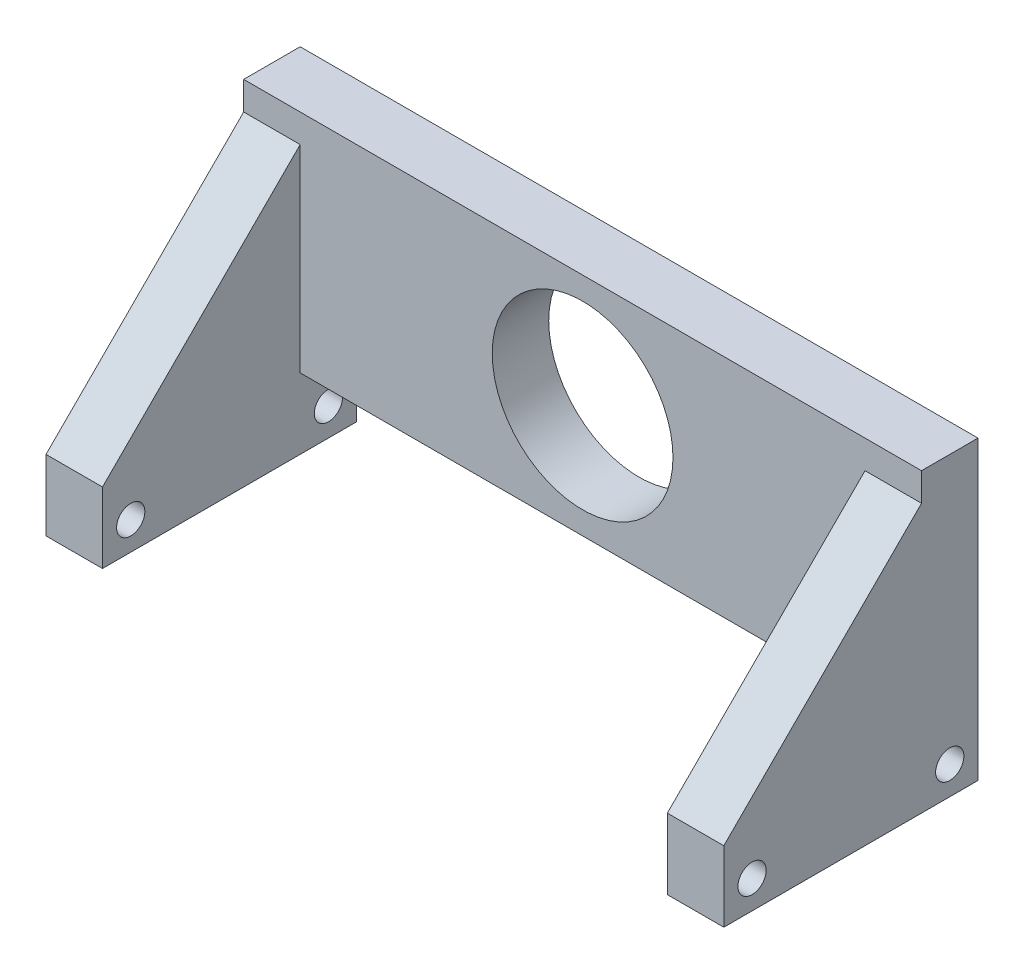
ISO-10303-21;
HEADER;
FILE_DESCRIPTION(('STEP AP214'),'2;1');
FILE_NAME('part.step','',(''),(''),'','','');
FILE_SCHEMA(('AUTOMOTIVE_DESIGN { 1 0 10303 214 1 1 1 1 }'));
ENDSEC;
DATA;
#1=APPLICATION_CONTEXT('core data for automotive mechanical design processes');
#2=APPLICATION_PROTOCOL_DEFINITION('international standard','automotive_design',2000,#1);
#3=PRODUCT_CONTEXT('',#1,'mechanical');
#4=PRODUCT('Part','Part','',(#3));
#5=PRODUCT_RELATED_PRODUCT_CATEGORY('part','',(#4));
#6=PRODUCT_DEFINITION_FORMATION('','',#4);
#7=PRODUCT_DEFINITION_CONTEXT('part definition',#1,'design');
#8=PRODUCT_DEFINITION('design','',#6,#7);
#9=PRODUCT_DEFINITION_SHAPE('','',#8);
#10=(LENGTH_UNIT() NAMED_UNIT(*) SI_UNIT(.MILLI.,.METRE.));
#11=(NAMED_UNIT(*) PLANE_ANGLE_UNIT() SI_UNIT($,.RADIAN.));
#12=(NAMED_UNIT(*) SI_UNIT($,.STERADIAN.) SOLID_ANGLE_UNIT());
#13=UNCERTAINTY_MEASURE_WITH_UNIT(LENGTH_MEASURE(1.E-05),#10,'distance_accuracy_value','');
#14=(GEOMETRIC_REPRESENTATION_CONTEXT(3) GLOBAL_UNCERTAINTY_ASSIGNED_CONTEXT((#13)) GLOBAL_UNIT_ASSIGNED_CONTEXT((#10,
#11,#12)) REPRESENTATION_CONTEXT('',''));
#15=CARTESIAN_POINT('',(0.,0.,0.));
#16=DIRECTION('',(0.,0.,1.));
#17=DIRECTION('',(1.,0.,0.));
#18=AXIS2_PLACEMENT_3D('',#15,#16,#17);
#19=CARTESIAN_POINT('',(-50.,20.,10.));
#20=DIRECTION('',(0.,-1.,0.));
#21=DIRECTION('',(0.,0.,-1.));
#22=AXIS2_PLACEMENT_3D('',#19,#20,#21);
#23=PLANE('',#22);
#24=DIRECTION('',(-1.,0.,0.));
#25=VECTOR('',#24,1.);
#26=CARTESIAN_POINT('',(-50.,20.,0.));
#27=LINE('',#26,#25);
#28=CARTESIAN_POINT('',(60.,20.,0.));
#29=VERTEX_POINT('',#28);
#30=CARTESIAN_POINT('',(-60.,20.,0.));
#31=VERTEX_POINT('',#30);
#32=EDGE_CURVE('E125',#29,#31,#27,.T.);
#33=ORIENTED_EDGE('',*,*,#32,.T.);
#34=DIRECTION('',(0.,0.,-1.));
#35=VECTOR('',#34,1.);
#36=CARTESIAN_POINT('',(-60.,20.,0.));
#37=LINE('',#36,#35);
#38=CARTESIAN_POINT('',(-60.,20.,10.));
#39=VERTEX_POINT('',#38);
#40=EDGE_CURVE('E208',#39,#31,#37,.T.);
#41=ORIENTED_EDGE('',*,*,#40,.F.);
#42=DIRECTION('',(-1.,0.,0.));
#43=VECTOR('',#42,1.);
#44=CARTESIAN_POINT('',(-50.,20.,10.));
#45=LINE('',#44,#43);
#46=CARTESIAN_POINT('',(60.,20.,10.));
#47=VERTEX_POINT('',#46);
#48=EDGE_CURVE('E152',#47,#39,#45,.T.);
#49=ORIENTED_EDGE('',*,*,#48,.F.);
#50=DIRECTION('',(0.,0.,-1.));
#51=VECTOR('',#50,1.);
#52=CARTESIAN_POINT('',(60.,20.,0.));
#53=LINE('',#52,#51);
#54=EDGE_CURVE('E144',#47,#29,#53,.T.);
#55=ORIENTED_EDGE('',*,*,#54,.T.);
#56=EDGE_LOOP('',(#33,#41,#49,#55));
#57=FACE_BOUND('',#56,.T.);
#58=ADVANCED_FACE('F37',(#57),#23,.F.);
#59=CARTESIAN_POINT('',(-50.,-20.,10.));
#60=DIRECTION('',(0.,1.,0.));
#61=DIRECTION('',(0.,0.,1.));
#62=AXIS2_PLACEMENT_3D('',#59,#60,#61);
#63=PLANE('',#62);
#64=DIRECTION('',(1.,0.,0.));
#65=VECTOR('',#64,1.);
#66=CARTESIAN_POINT('',(-50.,-20.,0.));
#67=LINE('',#66,#65);
#68=CARTESIAN_POINT('',(-50.,-20.,0.));
#69=VERTEX_POINT('',#68);
#70=CARTESIAN_POINT('',(50.,-20.,0.));
#71=VERTEX_POINT('',#70);
#72=EDGE_CURVE('E137',#69,#71,#67,.T.);
#73=ORIENTED_EDGE('',*,*,#72,.T.);
#74=DIRECTION('',(0.,0.,-1.));
#75=VECTOR('',#74,1.);
#76=CARTESIAN_POINT('',(50.,-20.,10.));
#77=LINE('',#76,#75);
#78=CARTESIAN_POINT('',(50.,-20.,10.));
#79=VERTEX_POINT('',#78);
#80=EDGE_CURVE('E44',#79,#71,#77,.T.);
#81=ORIENTED_EDGE('',*,*,#80,.F.);
#82=DIRECTION('',(1.,0.,0.));
#83=VECTOR('',#82,1.);
#84=CARTESIAN_POINT('',(-50.,-20.,10.));
#85=LINE('',#84,#83);
#86=CARTESIAN_POINT('',(-50.,-20.,10.));
#87=VERTEX_POINT('',#86);
#88=EDGE_CURVE('E56',#87,#79,#85,.T.);
#89=ORIENTED_EDGE('',*,*,#88,.F.);
#90=DIRECTION('',(0.,0.,-1.));
#91=VECTOR('',#90,1.);
#92=CARTESIAN_POINT('',(-50.,-20.,10.));
#93=LINE('',#92,#91);
#94=EDGE_CURVE('E11',#87,#69,#93,.T.);
#95=ORIENTED_EDGE('',*,*,#94,.T.);
#96=EDGE_LOOP('',(#73,#81,#89,#95));
#97=FACE_BOUND('',#96,.T.);
#98=ADVANCED_FACE('F269',(#97),#63,.F.);
#99=CARTESIAN_POINT('',(0.,0.,10.));
#100=DIRECTION('',(0.,0.,1.));
#101=DIRECTION('',(1.,0.,0.));
#102=AXIS2_PLACEMENT_3D('',#99,#100,#101);
#103=PLANE('',#102);
#104=CARTESIAN_POINT('',(0.,0.,10.));
#105=DIRECTION('',(0.,0.,1.));
#106=DIRECTION('',(1.,0.,0.));
#107=AXIS2_PLACEMENT_3D('',#104,#105,#106);
#108=CIRCLE('',#107,16.);
#109=CARTESIAN_POINT('',(16.,0.,10.));
#110=VERTEX_POINT('',#109);
#111=EDGE_CURVE('E229',#110,#110,#108,.T.);
#112=ORIENTED_EDGE('',*,*,#111,.F.);
#113=EDGE_LOOP('',(#112));
#114=FACE_BOUND('',#113,.T.);
#115=DIRECTION('',(0.,1.,0.));
#116=VECTOR('',#115,1.);
#117=CARTESIAN_POINT('',(50.,20.,10.));
#118=LINE('',#117,#116);
#119=CARTESIAN_POINT('',(50.,14.9999999999999,10.));
#120=VERTEX_POINT('',#119);
#121=EDGE_CURVE('E51',#79,#120,#118,.T.);
#122=ORIENTED_EDGE('',*,*,#121,.T.);
#123=DIRECTION('',(-1.,0.,0.));
#124=VECTOR('',#123,1.);
#125=CARTESIAN_POINT('',(60.,14.9999999999999,10.));
#126=LINE('',#125,#124);
#127=CARTESIAN_POINT('',(60.,14.9999999999999,10.));
#128=VERTEX_POINT('',#127);
#129=EDGE_CURVE('E182',#128,#120,#126,.T.);
#130=ORIENTED_EDGE('',*,*,#129,.F.);
#131=DIRECTION('',(0.,1.,0.));
#132=VECTOR('',#131,1.);
#133=CARTESIAN_POINT('',(60.,20.,10.));
#134=LINE('',#133,#132);
#135=EDGE_CURVE('E153',#128,#47,#134,.T.);
#136=ORIENTED_EDGE('',*,*,#135,.T.);
#137=ORIENTED_EDGE('',*,*,#48,.T.);
#138=DIRECTION('',(0.,1.,0.));
#139=VECTOR('',#138,1.);
#140=CARTESIAN_POINT('',(-60.,20.,10.));
#141=LINE('',#140,#139);
#142=CARTESIAN_POINT('',(-60.,14.9999999999999,10.));
#143=VERTEX_POINT('',#142);
#144=EDGE_CURVE('E205',#143,#39,#141,.T.);
#145=ORIENTED_EDGE('',*,*,#144,.F.);
#146=DIRECTION('',(1.,0.,0.));
#147=VECTOR('',#146,1.);
#148=CARTESIAN_POINT('',(-60.,14.9999999999999,10.));
#149=LINE('',#148,#147);
#150=CARTESIAN_POINT('',(-50.,14.9999999999999,10.));
#151=VERTEX_POINT('',#150);
#152=EDGE_CURVE('E210',#143,#151,#149,.T.);
#153=ORIENTED_EDGE('',*,*,#152,.T.);
#154=DIRECTION('',(0.,-1.,0.));
#155=VECTOR('',#154,1.);
#156=CARTESIAN_POINT('',(-50.,20.,10.));
#157=LINE('',#156,#155);
#158=EDGE_CURVE('E236',#151,#87,#157,.T.);
#159=ORIENTED_EDGE('',*,*,#158,.T.);
#160=ORIENTED_EDGE('',*,*,#88,.T.);
#161=EDGE_LOOP('',(#122,#130,#136,#137,#145,#153,#159,#160));
#162=FACE_BOUND('',#161,.T.);
#163=ADVANCED_FACE('F256',(#114,#162),#103,.T.);
#164=CARTESIAN_POINT('',(0.,0.,0.));
#165=DIRECTION('',(0.,0.,1.));
#166=DIRECTION('',(1.,0.,0.));
#167=AXIS2_PLACEMENT_3D('',#164,#165,#166);
#168=PLANE('',#167);
#169=CARTESIAN_POINT('',(0.,0.,0.));
#170=DIRECTION('',(0.,0.,1.));
#171=DIRECTION('',(1.,0.,0.));
#172=AXIS2_PLACEMENT_3D('',#169,#170,#171);
#173=CIRCLE('',#172,16.);
#174=CARTESIAN_POINT('',(16.,0.,0.));
#175=VERTEX_POINT('',#174);
#176=EDGE_CURVE('E138',#175,#175,#173,.T.);
#177=ORIENTED_EDGE('',*,*,#176,.T.);
#178=EDGE_LOOP('',(#177));
#179=FACE_BOUND('',#178,.T.);
#180=ORIENTED_EDGE('',*,*,#32,.F.);
#181=DIRECTION('',(0.,-1.,0.));
#182=VECTOR('',#181,1.);
#183=CARTESIAN_POINT('',(60.,20.,0.));
#184=LINE('',#183,#182);
#185=CARTESIAN_POINT('',(60.,-32.5,0.));
#186=VERTEX_POINT('',#185);
#187=EDGE_CURVE('E129',#29,#186,#184,.T.);
#188=ORIENTED_EDGE('',*,*,#187,.T.);
#189=DIRECTION('',(-1.,0.,0.));
#190=VECTOR('',#189,1.);
#191=CARTESIAN_POINT('',(60.,-32.5,0.));
#192=LINE('',#191,#190);
#193=CARTESIAN_POINT('',(50.,-32.5,0.));
#194=VERTEX_POINT('',#193);
#195=EDGE_CURVE('E165',#186,#194,#192,.T.);
#196=ORIENTED_EDGE('',*,*,#195,.T.);
#197=DIRECTION('',(0.,-1.,0.));
#198=VECTOR('',#197,1.);
#199=CARTESIAN_POINT('',(50.,20.,0.));
#200=LINE('',#199,#198);
#201=EDGE_CURVE('E166',#71,#194,#200,.T.);
#202=ORIENTED_EDGE('',*,*,#201,.F.);
#203=ORIENTED_EDGE('',*,*,#72,.F.);
#204=DIRECTION('',(0.,-1.,0.));
#205=VECTOR('',#204,1.);
#206=CARTESIAN_POINT('',(-50.,20.,0.));
#207=LINE('',#206,#205);
#208=CARTESIAN_POINT('',(-50.,-32.5,0.));
#209=VERTEX_POINT('',#208);
#210=EDGE_CURVE('E194',#69,#209,#207,.T.);
#211=ORIENTED_EDGE('',*,*,#210,.T.);
#212=DIRECTION('',(1.,0.,0.));
#213=VECTOR('',#212,1.);
#214=CARTESIAN_POINT('',(-60.,-32.5,0.));
#215=LINE('',#214,#213);
#216=CARTESIAN_POINT('',(-60.,-32.5,0.));
#217=VERTEX_POINT('',#216);
#218=EDGE_CURVE('E226',#217,#209,#215,.T.);
#219=ORIENTED_EDGE('',*,*,#218,.F.);
#220=DIRECTION('',(0.,-1.,0.));
#221=VECTOR('',#220,1.);
#222=CARTESIAN_POINT('',(-60.,20.,0.));
#223=LINE('',#222,#221);
#224=EDGE_CURVE('E132',#31,#217,#223,.T.);
#225=ORIENTED_EDGE('',*,*,#224,.F.);
#226=EDGE_LOOP('',(#180,#188,#196,#202,#203,#211,#219,#225));
#227=FACE_BOUND('',#226,.T.);
#228=ADVANCED_FACE('F127',(#179,#227),#168,.F.);
#229=CARTESIAN_POINT('',(0.,0.,0.));
#230=DIRECTION('',(0.,0.,1.));
#231=DIRECTION('',(1.,0.,0.));
#232=AXIS2_PLACEMENT_3D('',#229,#230,#231);
#233=CYLINDRICAL_SURFACE('',#232,16.);
#234=ORIENTED_EDGE('',*,*,#176,.F.);
#235=EDGE_LOOP('',(#234));
#236=FACE_BOUND('',#235,.T.);
#237=ORIENTED_EDGE('',*,*,#111,.T.);
#238=EDGE_LOOP('',(#237));
#239=FACE_BOUND('',#238,.T.);
#240=ADVANCED_FACE('F299',(#236,#239),#233,.F.);
#241=CARTESIAN_POINT('',(-60.,0.,0.));
#242=DIRECTION('',(-1.,0.,0.));
#243=DIRECTION('',(0.,0.,1.));
#244=AXIS2_PLACEMENT_3D('',#241,#242,#243);
#245=PLANE('',#244);
#246=CARTESIAN_POINT('',(-60.,-27.5,5.));
#247=DIRECTION('',(-1.,0.,0.));
#248=DIRECTION('',(0.,0.,1.));
#249=AXIS2_PLACEMENT_3D('',#246,#247,#248);
#250=CIRCLE('',#249,2.5);
#251=CARTESIAN_POINT('',(-60.,-27.5,7.5));
#252=VERTEX_POINT('',#251);
#253=EDGE_CURVE('E191',#252,#252,#250,.T.);
#254=ORIENTED_EDGE('',*,*,#253,.F.);
#255=EDGE_LOOP('',(#254));
#256=FACE_BOUND('',#255,.T.);
#257=ORIENTED_EDGE('',*,*,#224,.T.);
#258=DIRECTION('',(0.,0.,1.));
#259=VECTOR('',#258,1.);
#260=CARTESIAN_POINT('',(-60.,-32.5,0.));
#261=LINE('',#260,#259);
#262=CARTESIAN_POINT('',(-60.,-32.5,45.));
#263=VERTEX_POINT('',#262);
#264=EDGE_CURVE('E198',#217,#263,#261,.T.);
#265=ORIENTED_EDGE('',*,*,#264,.T.);
#266=DIRECTION('',(0.,1.,0.));
#267=VECTOR('',#266,1.);
#268=CARTESIAN_POINT('',(-60.,-32.5,45.));
#269=LINE('',#268,#267);
#270=CARTESIAN_POINT('',(-60.,-20.,45.));
#271=VERTEX_POINT('',#270);
#272=EDGE_CURVE('E201',#263,#271,#269,.T.);
#273=ORIENTED_EDGE('',*,*,#272,.T.);
#274=DIRECTION('',(0.,0.707106781186546,-0.707106781186549));
#275=VECTOR('',#274,1.);
#276=CARTESIAN_POINT('',(-60.,-20.,45.));
#277=LINE('',#276,#275);
#278=EDGE_CURVE('E203',#271,#143,#277,.T.);
#279=ORIENTED_EDGE('',*,*,#278,.T.);
#280=ORIENTED_EDGE('',*,*,#144,.T.);
#281=ORIENTED_EDGE('',*,*,#40,.T.);
#282=EDGE_LOOP('',(#257,#265,#273,#279,#280,#281));
#283=FACE_BOUND('',#282,.T.);
#284=CARTESIAN_POINT('',(-60.,-27.5,40.));
#285=DIRECTION('',(-1.,0.,0.));
#286=DIRECTION('',(0.,0.,1.));
#287=AXIS2_PLACEMENT_3D('',#284,#285,#286);
#288=CIRCLE('',#287,2.5);
#289=CARTESIAN_POINT('',(-60.,-27.5,42.5));
#290=VERTEX_POINT('',#289);
#291=EDGE_CURVE('E185',#290,#290,#288,.T.);
#292=ORIENTED_EDGE('',*,*,#291,.F.);
#293=EDGE_LOOP('',(#292));
#294=FACE_BOUND('',#293,.T.);
#295=ADVANCED_FACE('F259',(#256,#283,#294),#245,.T.);
#296=CARTESIAN_POINT('',(-50.,0.,0.));
#297=DIRECTION('',(-1.,0.,0.));
#298=DIRECTION('',(0.,0.,1.));
#299=AXIS2_PLACEMENT_3D('',#296,#297,#298);
#300=PLANE('',#299);
#301=ORIENTED_EDGE('',*,*,#94,.F.);
#302=ORIENTED_EDGE('',*,*,#158,.F.);
#303=DIRECTION('',(0.,0.707106781186546,-0.707106781186549));
#304=VECTOR('',#303,1.);
#305=CARTESIAN_POINT('',(-50.,-20.,45.));
#306=LINE('',#305,#304);
#307=CARTESIAN_POINT('',(-50.,-20.,45.));
#308=VERTEX_POINT('',#307);
#309=EDGE_CURVE('E199',#308,#151,#306,.T.);
#310=ORIENTED_EDGE('',*,*,#309,.F.);
#311=DIRECTION('',(0.,1.,0.));
#312=VECTOR('',#311,1.);
#313=CARTESIAN_POINT('',(-50.,-32.5,45.));
#314=LINE('',#313,#312);
#315=CARTESIAN_POINT('',(-50.,-32.5,45.));
#316=VERTEX_POINT('',#315);
#317=EDGE_CURVE('E214',#316,#308,#314,.T.);
#318=ORIENTED_EDGE('',*,*,#317,.F.);
#319=DIRECTION('',(0.,0.,1.));
#320=VECTOR('',#319,1.);
#321=CARTESIAN_POINT('',(-50.,-32.5,9.99999999999999));
#322=LINE('',#321,#320);
#323=EDGE_CURVE('E212',#209,#316,#322,.T.);
#324=ORIENTED_EDGE('',*,*,#323,.F.);
#325=ORIENTED_EDGE('',*,*,#210,.F.);
#326=EDGE_LOOP('',(#301,#302,#310,#318,#324,#325));
#327=FACE_BOUND('',#326,.T.);
#328=CARTESIAN_POINT('',(-50.,-27.5,5.));
#329=DIRECTION('',(-1.,0.,0.));
#330=DIRECTION('',(0.,0.,1.));
#331=AXIS2_PLACEMENT_3D('',#328,#329,#330);
#332=CIRCLE('',#331,2.5);
#333=CARTESIAN_POINT('',(-50.,-27.5,7.5));
#334=VERTEX_POINT('',#333);
#335=EDGE_CURVE('E188',#334,#334,#332,.T.);
#336=ORIENTED_EDGE('',*,*,#335,.T.);
#337=EDGE_LOOP('',(#336));
#338=FACE_BOUND('',#337,.T.);
#339=CARTESIAN_POINT('',(-50.,-27.5,40.));
#340=DIRECTION('',(-1.,0.,0.));
#341=DIRECTION('',(0.,0.,1.));
#342=AXIS2_PLACEMENT_3D('',#339,#340,#341);
#343=CIRCLE('',#342,2.5);
#344=CARTESIAN_POINT('',(-50.,-27.5,42.5));
#345=VERTEX_POINT('',#344);
#346=EDGE_CURVE('E184',#345,#345,#343,.T.);
#347=ORIENTED_EDGE('',*,*,#346,.T.);
#348=EDGE_LOOP('',(#347));
#349=FACE_BOUND('',#348,.T.);
#350=ADVANCED_FACE('F270',(#327,#338,#349),#300,.F.);
#351=CARTESIAN_POINT('',(-60.,-32.5,9.99999999999999));
#352=DIRECTION('',(0.,1.,0.));
#353=DIRECTION('',(0.,0.,1.));
#354=AXIS2_PLACEMENT_3D('',#351,#352,#353);
#355=PLANE('',#354);
#356=ORIENTED_EDGE('',*,*,#323,.T.);
#357=DIRECTION('',(1.,0.,0.));
#358=VECTOR('',#357,1.);
#359=CARTESIAN_POINT('',(-60.,-32.5,45.));
#360=LINE('',#359,#358);
#361=EDGE_CURVE('E223',#263,#316,#360,.T.);
#362=ORIENTED_EDGE('',*,*,#361,.F.);
#363=ORIENTED_EDGE('',*,*,#264,.F.);
#364=ORIENTED_EDGE('',*,*,#218,.T.);
#365=EDGE_LOOP('',(#356,#362,#363,#364));
#366=FACE_BOUND('',#365,.T.);
#367=ADVANCED_FACE('F275',(#366),#355,.F.);
#368=CARTESIAN_POINT('',(-60.,-32.5,45.));
#369=DIRECTION('',(0.,0.,-1.));
#370=DIRECTION('',(-1.,0.,0.));
#371=AXIS2_PLACEMENT_3D('',#368,#369,#370);
#372=PLANE('',#371);
#373=ORIENTED_EDGE('',*,*,#317,.T.);
#374=DIRECTION('',(1.,0.,0.));
#375=VECTOR('',#374,1.);
#376=CARTESIAN_POINT('',(-60.,-20.,45.));
#377=LINE('',#376,#375);
#378=EDGE_CURVE('E220',#271,#308,#377,.T.);
#379=ORIENTED_EDGE('',*,*,#378,.F.);
#380=ORIENTED_EDGE('',*,*,#272,.F.);
#381=ORIENTED_EDGE('',*,*,#361,.T.);
#382=EDGE_LOOP('',(#373,#379,#380,#381));
#383=FACE_BOUND('',#382,.T.);
#384=ADVANCED_FACE('F278',(#383),#372,.F.);
#385=CARTESIAN_POINT('',(-60.,-20.,45.));
#386=DIRECTION('',(0.,-0.707106781186549,-0.707106781186546));
#387=DIRECTION('',(0.,0.707106781186546,-0.707106781186549));
#388=AXIS2_PLACEMENT_3D('',#385,#386,#387);
#389=PLANE('',#388);
#390=ORIENTED_EDGE('',*,*,#309,.T.);
#391=ORIENTED_EDGE('',*,*,#152,.F.);
#392=ORIENTED_EDGE('',*,*,#278,.F.);
#393=ORIENTED_EDGE('',*,*,#378,.T.);
#394=EDGE_LOOP('',(#390,#391,#392,#393));
#395=FACE_BOUND('',#394,.T.);
#396=ADVANCED_FACE('F266',(#395),#389,.F.);
#397=CARTESIAN_POINT('',(-60.,-27.5,5.));
#398=DIRECTION('',(1.,0.,0.));
#399=DIRECTION('',(0.,0.,-1.));
#400=AXIS2_PLACEMENT_3D('',#397,#398,#399);
#401=CYLINDRICAL_SURFACE('',#400,2.5);
#402=ORIENTED_EDGE('',*,*,#253,.T.);
#403=EDGE_LOOP('',(#402));
#404=FACE_BOUND('',#403,.T.);
#405=ORIENTED_EDGE('',*,*,#335,.F.);
#406=EDGE_LOOP('',(#405));
#407=FACE_BOUND('',#406,.T.);
#408=ADVANCED_FACE('F285',(#404,#407),#401,.F.);
#409=CARTESIAN_POINT('',(-60.,-27.5,40.));
#410=DIRECTION('',(1.,0.,0.));
#411=DIRECTION('',(0.,0.,-1.));
#412=AXIS2_PLACEMENT_3D('',#409,#410,#411);
#413=CYLINDRICAL_SURFACE('',#412,2.5);
#414=ORIENTED_EDGE('',*,*,#291,.T.);
#415=EDGE_LOOP('',(#414));
#416=FACE_BOUND('',#415,.T.);
#417=ORIENTED_EDGE('',*,*,#346,.F.);
#418=EDGE_LOOP('',(#417));
#419=FACE_BOUND('',#418,.T.);
#420=ADVANCED_FACE('F320',(#416,#419),#413,.F.);
#421=CARTESIAN_POINT('',(60.,-20.,45.));
#422=DIRECTION('',(0.,0.707106781186549,0.707106781186546));
#423=DIRECTION('',(0.,-0.707106781186546,0.707106781186549));
#424=AXIS2_PLACEMENT_3D('',#421,#422,#423);
#425=PLANE('',#424);
#426=DIRECTION('',(0.,0.707106781186546,-0.707106781186549));
#427=VECTOR('',#426,1.);
#428=CARTESIAN_POINT('',(50.,-20.,45.));
#429=LINE('',#428,#427);
#430=CARTESIAN_POINT('',(50.,-20.,45.));
#431=VERTEX_POINT('',#430);
#432=EDGE_CURVE('E168',#431,#120,#429,.T.);
#433=ORIENTED_EDGE('',*,*,#432,.F.);
#434=DIRECTION('',(-1.,0.,0.));
#435=VECTOR('',#434,1.);
#436=CARTESIAN_POINT('',(60.,-20.,45.));
#437=LINE('',#436,#435);
#438=CARTESIAN_POINT('',(60.,-20.,45.));
#439=VERTEX_POINT('',#438);
#440=EDGE_CURVE('E180',#439,#431,#437,.T.);
#441=ORIENTED_EDGE('',*,*,#440,.F.);
#442=DIRECTION('',(0.,0.707106781186546,-0.707106781186549));
#443=VECTOR('',#442,1.);
#444=CARTESIAN_POINT('',(60.,-20.,45.));
#445=LINE('',#444,#443);
#446=EDGE_CURVE('E155',#439,#128,#445,.T.);
#447=ORIENTED_EDGE('',*,*,#446,.T.);
#448=ORIENTED_EDGE('',*,*,#129,.T.);
#449=EDGE_LOOP('',(#433,#441,#447,#448));
#450=FACE_BOUND('',#449,.T.);
#451=ADVANCED_FACE('F255',(#450),#425,.T.);
#452=CARTESIAN_POINT('',(60.,-32.5,45.));
#453=DIRECTION('',(0.,0.,1.));
#454=DIRECTION('',(1.,0.,0.));
#455=AXIS2_PLACEMENT_3D('',#452,#453,#454);
#456=PLANE('',#455);
#457=DIRECTION('',(0.,1.,0.));
#458=VECTOR('',#457,1.);
#459=CARTESIAN_POINT('',(50.,-32.5,45.));
#460=LINE('',#459,#458);
#461=CARTESIAN_POINT('',(50.,-32.5,45.));
#462=VERTEX_POINT('',#461);
#463=EDGE_CURVE('E172',#462,#431,#460,.T.);
#464=ORIENTED_EDGE('',*,*,#463,.F.);
#465=DIRECTION('',(-1.,0.,0.));
#466=VECTOR('',#465,1.);
#467=CARTESIAN_POINT('',(60.,-32.5,45.));
#468=LINE('',#467,#466);
#469=CARTESIAN_POINT('',(60.,-32.5,45.));
#470=VERTEX_POINT('',#469);
#471=EDGE_CURVE('E177',#470,#462,#468,.T.);
#472=ORIENTED_EDGE('',*,*,#471,.F.);
#473=DIRECTION('',(0.,1.,0.));
#474=VECTOR('',#473,1.);
#475=CARTESIAN_POINT('',(60.,-32.5,45.));
#476=LINE('',#475,#474);
#477=EDGE_CURVE('E161',#470,#439,#476,.T.);
#478=ORIENTED_EDGE('',*,*,#477,.T.);
#479=ORIENTED_EDGE('',*,*,#440,.T.);
#480=EDGE_LOOP('',(#464,#472,#478,#479));
#481=FACE_BOUND('',#480,.T.);
#482=ADVANCED_FACE('F252',(#481),#456,.T.);
#483=CARTESIAN_POINT('',(60.,-32.5,0.));
#484=DIRECTION('',(0.,-1.,0.));
#485=DIRECTION('',(0.,0.,-1.));
#486=AXIS2_PLACEMENT_3D('',#483,#484,#485);
#487=PLANE('',#486);
#488=DIRECTION('',(0.,0.,1.));
#489=VECTOR('',#488,1.);
#490=CARTESIAN_POINT('',(50.,-32.5,0.));
#491=LINE('',#490,#489);
#492=EDGE_CURVE('E150',#194,#462,#491,.T.);
#493=ORIENTED_EDGE('',*,*,#492,.F.);
#494=ORIENTED_EDGE('',*,*,#195,.F.);
#495=DIRECTION('',(0.,0.,1.));
#496=VECTOR('',#495,1.);
#497=CARTESIAN_POINT('',(60.,-32.5,9.99999999999999));
#498=LINE('',#497,#496);
#499=EDGE_CURVE('E148',#186,#470,#498,.T.);
#500=ORIENTED_EDGE('',*,*,#499,.T.);
#501=ORIENTED_EDGE('',*,*,#471,.T.);
#502=EDGE_LOOP('',(#493,#494,#500,#501));
#503=FACE_BOUND('',#502,.T.);
#504=ADVANCED_FACE('F248',(#503),#487,.T.);
#505=CARTESIAN_POINT('',(60.,0.,0.));
#506=DIRECTION('',(1.,0.,0.));
#507=DIRECTION('',(0.,0.,1.));
#508=AXIS2_PLACEMENT_3D('',#505,#506,#507);
#509=PLANE('',#508);
#510=CARTESIAN_POINT('',(60.,-27.5,40.));
#511=DIRECTION('',(-1.,0.,0.));
#512=DIRECTION('',(0.,0.,1.));
#513=AXIS2_PLACEMENT_3D('',#510,#511,#512);
#514=CIRCLE('',#513,2.5);
#515=CARTESIAN_POINT('',(60.,-27.5,42.5));
#516=VERTEX_POINT('',#515);
#517=EDGE_CURVE('E348',#516,#516,#514,.T.);
#518=ORIENTED_EDGE('',*,*,#517,.T.);
#519=EDGE_LOOP('',(#518));
#520=FACE_BOUND('',#519,.T.);
#521=CARTESIAN_POINT('',(60.,-27.5,5.));
#522=DIRECTION('',(-1.,0.,0.));
#523=DIRECTION('',(0.,0.,1.));
#524=AXIS2_PLACEMENT_3D('',#521,#522,#523);
#525=CIRCLE('',#524,2.5);
#526=CARTESIAN_POINT('',(60.,-27.5,7.5));
#527=VERTEX_POINT('',#526);
#528=EDGE_CURVE('E169',#527,#527,#525,.T.);
#529=ORIENTED_EDGE('',*,*,#528,.T.);
#530=EDGE_LOOP('',(#529));
#531=FACE_BOUND('',#530,.T.);
#532=ORIENTED_EDGE('',*,*,#187,.F.);
#533=ORIENTED_EDGE('',*,*,#54,.F.);
#534=ORIENTED_EDGE('',*,*,#135,.F.);
#535=ORIENTED_EDGE('',*,*,#446,.F.);
#536=ORIENTED_EDGE('',*,*,#477,.F.);
#537=ORIENTED_EDGE('',*,*,#499,.F.);
#538=EDGE_LOOP('',(#532,#533,#534,#535,#536,#537));
#539=FACE_BOUND('',#538,.T.);
#540=ADVANCED_FACE('F142',(#520,#531,#539),#509,.T.);
#541=CARTESIAN_POINT('',(50.,0.,0.));
#542=DIRECTION('',(1.,0.,0.));
#543=DIRECTION('',(0.,0.,1.));
#544=AXIS2_PLACEMENT_3D('',#541,#542,#543);
#545=PLANE('',#544);
#546=ORIENTED_EDGE('',*,*,#121,.F.);
#547=ORIENTED_EDGE('',*,*,#80,.T.);
#548=ORIENTED_EDGE('',*,*,#201,.T.);
#549=ORIENTED_EDGE('',*,*,#492,.T.);
#550=ORIENTED_EDGE('',*,*,#463,.T.);
#551=ORIENTED_EDGE('',*,*,#432,.T.);
#552=EDGE_LOOP('',(#546,#547,#548,#549,#550,#551));
#553=FACE_BOUND('',#552,.T.);
#554=CARTESIAN_POINT('',(50.,-27.5,40.));
#555=DIRECTION('',(-1.,0.,0.));
#556=DIRECTION('',(0.,0.,1.));
#557=AXIS2_PLACEMENT_3D('',#554,#555,#556);
#558=CIRCLE('',#557,2.5);
#559=CARTESIAN_POINT('',(50.,-27.5,42.5));
#560=VERTEX_POINT('',#559);
#561=EDGE_CURVE('E351',#560,#560,#558,.T.);
#562=ORIENTED_EDGE('',*,*,#561,.F.);
#563=EDGE_LOOP('',(#562));
#564=FACE_BOUND('',#563,.T.);
#565=CARTESIAN_POINT('',(50.,-27.5,5.));
#566=DIRECTION('',(-1.,0.,0.));
#567=DIRECTION('',(0.,0.,1.));
#568=AXIS2_PLACEMENT_3D('',#565,#566,#567);
#569=CIRCLE('',#568,2.5);
#570=CARTESIAN_POINT('',(50.,-27.5,7.5));
#571=VERTEX_POINT('',#570);
#572=EDGE_CURVE('E353',#571,#571,#569,.T.);
#573=ORIENTED_EDGE('',*,*,#572,.F.);
#574=EDGE_LOOP('',(#573));
#575=FACE_BOUND('',#574,.T.);
#576=ADVANCED_FACE('F242',(#553,#564,#575),#545,.F.);
#577=CARTESIAN_POINT('',(60.,-27.5,5.));
#578=DIRECTION('',(-1.,0.,0.));
#579=DIRECTION('',(0.,0.,1.));
#580=AXIS2_PLACEMENT_3D('',#577,#578,#579);
#581=CYLINDRICAL_SURFACE('',#580,2.5);
#582=ORIENTED_EDGE('',*,*,#528,.F.);
#583=EDGE_LOOP('',(#582));
#584=FACE_BOUND('',#583,.T.);
#585=ORIENTED_EDGE('',*,*,#572,.T.);
#586=EDGE_LOOP('',(#585));
#587=FACE_BOUND('',#586,.T.);
#588=ADVANCED_FACE('F333',(#584,#587),#581,.F.);
#589=CARTESIAN_POINT('',(60.,-27.5,40.));
#590=DIRECTION('',(-1.,0.,0.));
#591=DIRECTION('',(0.,0.,1.));
#592=AXIS2_PLACEMENT_3D('',#589,#590,#591);
#593=CYLINDRICAL_SURFACE('',#592,2.5);
#594=ORIENTED_EDGE('',*,*,#517,.F.);
#595=EDGE_LOOP('',(#594));
#596=FACE_BOUND('',#595,.T.);
#597=ORIENTED_EDGE('',*,*,#561,.T.);
#598=EDGE_LOOP('',(#597));
#599=FACE_BOUND('',#598,.T.);
#600=ADVANCED_FACE('F339',(#596,#599),#593,.F.);
#601=CLOSED_SHELL('',(#58,#98,#163,#228,#240,#295,#350,#367,#384,#396,#408,#420,#451,#482,#504,
#540,#576,#588,#600));
#602=MANIFOLD_SOLID_BREP('B2',#601);
#603=ADVANCED_BREP_SHAPE_REPRESENTATION('',(#18,#602),#14);
#604=SHAPE_DEFINITION_REPRESENTATION(#9,#603);
ENDSEC;
END-ISO-10303-21;
